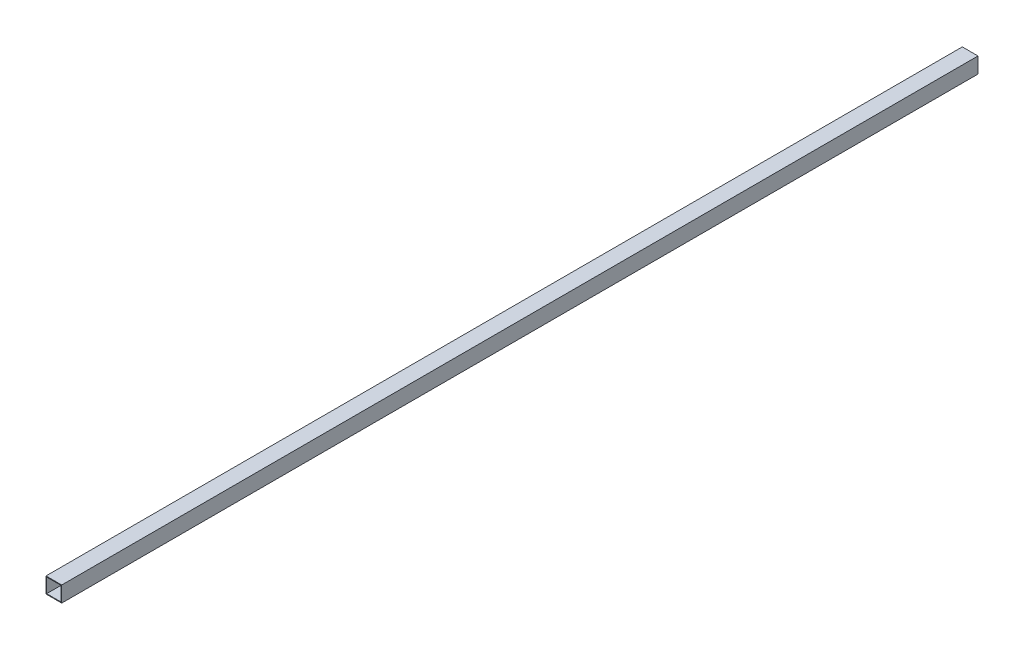
ISO-10303-21;
HEADER;
FILE_DESCRIPTION(('STEP AP214'),'2;1');
FILE_NAME('part.step','',(''),(''),'','','');
FILE_SCHEMA(('AUTOMOTIVE_DESIGN { 1 0 10303 214 1 1 1 1 }'));
ENDSEC;
DATA;
#1=APPLICATION_CONTEXT('core data for automotive mechanical design processes');
#2=APPLICATION_PROTOCOL_DEFINITION('international standard','automotive_design',2000,#1);
#3=PRODUCT_CONTEXT('',#1,'mechanical');
#4=PRODUCT('Part','Part','',(#3));
#5=PRODUCT_RELATED_PRODUCT_CATEGORY('part','',(#4));
#6=PRODUCT_DEFINITION_FORMATION('','',#4);
#7=PRODUCT_DEFINITION_CONTEXT('part definition',#1,'design');
#8=PRODUCT_DEFINITION('design','',#6,#7);
#9=PRODUCT_DEFINITION_SHAPE('','',#8);
#10=(LENGTH_UNIT() NAMED_UNIT(*) SI_UNIT(.MILLI.,.METRE.));
#11=(NAMED_UNIT(*) PLANE_ANGLE_UNIT() SI_UNIT($,.RADIAN.));
#12=(NAMED_UNIT(*) SI_UNIT($,.STERADIAN.) SOLID_ANGLE_UNIT());
#13=UNCERTAINTY_MEASURE_WITH_UNIT(LENGTH_MEASURE(1.E-05),#10,'distance_accuracy_value','');
#14=(GEOMETRIC_REPRESENTATION_CONTEXT(3) GLOBAL_UNCERTAINTY_ASSIGNED_CONTEXT((#13)) GLOBAL_UNIT_ASSIGNED_CONTEXT((#10,
#11,#12)) REPRESENTATION_CONTEXT('',''));
#15=CARTESIAN_POINT('',(0.,0.,0.));
#16=DIRECTION('',(0.,0.,1.));
#17=DIRECTION('',(1.,0.,0.));
#18=AXIS2_PLACEMENT_3D('',#15,#16,#17);
#19=CARTESIAN_POINT('',(0.,0.,2222.5));
#20=DIRECTION('',(0.,0.,-1.));
#21=DIRECTION('',(-1.,0.,0.));
#22=AXIS2_PLACEMENT_3D('',#19,#20,#21);
#23=PLANE('',#22);
#24=DIRECTION('',(0.,-1.,0.));
#25=VECTOR('',#24,1.);
#26=CARTESIAN_POINT('',(0.,0.,2222.5));
#27=LINE('',#26,#25);
#28=CARTESIAN_POINT('',(0.,38.1,2222.5));
#29=VERTEX_POINT('',#28);
#30=CARTESIAN_POINT('',(0.,0.,2222.5));
#31=VERTEX_POINT('',#30);
#32=EDGE_CURVE('E136',#29,#31,#27,.T.);
#33=ORIENTED_EDGE('',*,*,#32,.T.);
#34=DIRECTION('',(1.,0.,0.));
#35=VECTOR('',#34,1.);
#36=CARTESIAN_POINT('',(0.,0.,2222.5));
#37=LINE('',#36,#35);
#38=CARTESIAN_POINT('',(38.1,0.,2222.5));
#39=VERTEX_POINT('',#38);
#40=EDGE_CURVE('E139',#31,#39,#37,.T.);
#41=ORIENTED_EDGE('',*,*,#40,.T.);
#42=DIRECTION('',(0.,1.,0.));
#43=VECTOR('',#42,1.);
#44=CARTESIAN_POINT('',(38.1,0.,2222.5));
#45=LINE('',#44,#43);
#46=CARTESIAN_POINT('',(38.1,38.1,2222.5));
#47=VERTEX_POINT('',#46);
#48=EDGE_CURVE('E142',#39,#47,#45,.T.);
#49=ORIENTED_EDGE('',*,*,#48,.T.);
#50=DIRECTION('',(-1.,0.,0.));
#51=VECTOR('',#50,1.);
#52=CARTESIAN_POINT('',(0.,38.1,2222.5));
#53=LINE('',#52,#51);
#54=EDGE_CURVE('E144',#47,#29,#53,.T.);
#55=ORIENTED_EDGE('',*,*,#54,.T.);
#56=EDGE_LOOP('',(#33,#41,#49,#55));
#57=FACE_BOUND('',#56,.T.);
#58=DIRECTION('',(0.,-1.,0.));
#59=VECTOR('',#58,1.);
#60=CARTESIAN_POINT('',(1.5875,1.5875,2222.5));
#61=LINE('',#60,#59);
#62=CARTESIAN_POINT('',(1.5875,36.5125,2222.5));
#63=VERTEX_POINT('',#62);
#64=CARTESIAN_POINT('',(1.5875,1.5875,2222.5));
#65=VERTEX_POINT('',#64);
#66=EDGE_CURVE('E100',#63,#65,#61,.T.);
#67=ORIENTED_EDGE('',*,*,#66,.F.);
#68=DIRECTION('',(-1.,0.,0.));
#69=VECTOR('',#68,1.);
#70=CARTESIAN_POINT('',(1.5875,36.5125,2222.5));
#71=LINE('',#70,#69);
#72=CARTESIAN_POINT('',(36.5125,36.5125,2222.5));
#73=VERTEX_POINT('',#72);
#74=EDGE_CURVE('E122',#73,#63,#71,.T.);
#75=ORIENTED_EDGE('',*,*,#74,.F.);
#76=DIRECTION('',(0.,1.,0.));
#77=VECTOR('',#76,1.);
#78=CARTESIAN_POINT('',(36.5125,1.5875,2222.5));
#79=LINE('',#78,#77);
#80=CARTESIAN_POINT('',(36.5125,1.5875,2222.5));
#81=VERTEX_POINT('',#80);
#82=EDGE_CURVE('E120',#81,#73,#79,.T.);
#83=ORIENTED_EDGE('',*,*,#82,.F.);
#84=DIRECTION('',(1.,0.,0.));
#85=VECTOR('',#84,1.);
#86=CARTESIAN_POINT('',(1.5875,1.5875,2222.5));
#87=LINE('',#86,#85);
#88=EDGE_CURVE('E108',#65,#81,#87,.T.);
#89=ORIENTED_EDGE('',*,*,#88,.F.);
#90=EDGE_LOOP('',(#67,#75,#83,#89));
#91=FACE_BOUND('',#90,.T.);
#92=ADVANCED_FACE('F35',(#57,#91),#23,.F.);
#93=CARTESIAN_POINT('',(0.,0.,0.));
#94=DIRECTION('',(0.,0.,-1.));
#95=DIRECTION('',(-1.,0.,0.));
#96=AXIS2_PLACEMENT_3D('',#93,#94,#95);
#97=PLANE('',#96);
#98=DIRECTION('',(0.,-1.,0.));
#99=VECTOR('',#98,1.);
#100=CARTESIAN_POINT('',(0.,0.,0.));
#101=LINE('',#100,#99);
#102=CARTESIAN_POINT('',(0.,38.1,0.));
#103=VERTEX_POINT('',#102);
#104=CARTESIAN_POINT('',(0.,0.,0.));
#105=VERTEX_POINT('',#104);
#106=EDGE_CURVE('E116',#103,#105,#101,.T.);
#107=ORIENTED_EDGE('',*,*,#106,.F.);
#108=DIRECTION('',(-1.,0.,0.));
#109=VECTOR('',#108,1.);
#110=CARTESIAN_POINT('',(0.,38.1,0.));
#111=LINE('',#110,#109);
#112=CARTESIAN_POINT('',(38.1,38.1,0.));
#113=VERTEX_POINT('',#112);
#114=EDGE_CURVE('E140',#113,#103,#111,.T.);
#115=ORIENTED_EDGE('',*,*,#114,.F.);
#116=DIRECTION('',(0.,1.,0.));
#117=VECTOR('',#116,1.);
#118=CARTESIAN_POINT('',(38.1,0.,0.));
#119=LINE('',#118,#117);
#120=CARTESIAN_POINT('',(38.1,0.,0.));
#121=VERTEX_POINT('',#120);
#122=EDGE_CURVE('E151',#121,#113,#119,.T.);
#123=ORIENTED_EDGE('',*,*,#122,.F.);
#124=DIRECTION('',(1.,0.,0.));
#125=VECTOR('',#124,1.);
#126=CARTESIAN_POINT('',(0.,0.,0.));
#127=LINE('',#126,#125);
#128=EDGE_CURVE('E149',#105,#121,#127,.T.);
#129=ORIENTED_EDGE('',*,*,#128,.F.);
#130=EDGE_LOOP('',(#107,#115,#123,#129));
#131=FACE_BOUND('',#130,.T.);
#132=DIRECTION('',(-1.,0.,0.));
#133=VECTOR('',#132,1.);
#134=CARTESIAN_POINT('',(1.5875,36.5125,0.));
#135=LINE('',#134,#133);
#136=CARTESIAN_POINT('',(36.5125,36.5125,0.));
#137=VERTEX_POINT('',#136);
#138=CARTESIAN_POINT('',(1.5875,36.5125,0.));
#139=VERTEX_POINT('',#138);
#140=EDGE_CURVE('E109',#137,#139,#135,.T.);
#141=ORIENTED_EDGE('',*,*,#140,.T.);
#142=DIRECTION('',(0.,-1.,0.));
#143=VECTOR('',#142,1.);
#144=CARTESIAN_POINT('',(1.5875,1.5875,0.));
#145=LINE('',#144,#143);
#146=CARTESIAN_POINT('',(1.5875,1.5875,0.));
#147=VERTEX_POINT('',#146);
#148=EDGE_CURVE('E58',#139,#147,#145,.T.);
#149=ORIENTED_EDGE('',*,*,#148,.T.);
#150=DIRECTION('',(1.,0.,0.));
#151=VECTOR('',#150,1.);
#152=CARTESIAN_POINT('',(1.5875,1.5875,0.));
#153=LINE('',#152,#151);
#154=CARTESIAN_POINT('',(36.5125,1.5875,0.));
#155=VERTEX_POINT('',#154);
#156=EDGE_CURVE('E115',#147,#155,#153,.T.);
#157=ORIENTED_EDGE('',*,*,#156,.T.);
#158=DIRECTION('',(0.,1.,0.));
#159=VECTOR('',#158,1.);
#160=CARTESIAN_POINT('',(36.5125,1.5875,0.));
#161=LINE('',#160,#159);
#162=EDGE_CURVE('E128',#155,#137,#161,.T.);
#163=ORIENTED_EDGE('',*,*,#162,.T.);
#164=EDGE_LOOP('',(#141,#149,#157,#163));
#165=FACE_BOUND('',#164,.T.);
#166=ADVANCED_FACE('F169',(#131,#165),#97,.T.);
#167=CARTESIAN_POINT('',(0.,0.,2222.5));
#168=DIRECTION('',(1.,0.,0.));
#169=DIRECTION('',(0.,0.,-1.));
#170=AXIS2_PLACEMENT_3D('',#167,#168,#169);
#171=PLANE('',#170);
#172=ORIENTED_EDGE('',*,*,#106,.T.);
#173=DIRECTION('',(0.,0.,-1.));
#174=VECTOR('',#173,1.);
#175=CARTESIAN_POINT('',(0.,0.,2222.5));
#176=LINE('',#175,#174);
#177=EDGE_CURVE('E11',#31,#105,#176,.T.);
#178=ORIENTED_EDGE('',*,*,#177,.F.);
#179=ORIENTED_EDGE('',*,*,#32,.F.);
#180=DIRECTION('',(0.,0.,-1.));
#181=VECTOR('',#180,1.);
#182=CARTESIAN_POINT('',(0.,38.1,2222.5));
#183=LINE('',#182,#181);
#184=EDGE_CURVE('E146',#29,#103,#183,.T.);
#185=ORIENTED_EDGE('',*,*,#184,.T.);
#186=EDGE_LOOP('',(#172,#178,#179,#185));
#187=FACE_BOUND('',#186,.T.);
#188=ADVANCED_FACE('F37',(#187),#171,.F.);
#189=CARTESIAN_POINT('',(0.,0.,2222.5));
#190=DIRECTION('',(0.,1.,0.));
#191=DIRECTION('',(0.,0.,1.));
#192=AXIS2_PLACEMENT_3D('',#189,#190,#191);
#193=PLANE('',#192);
#194=ORIENTED_EDGE('',*,*,#128,.T.);
#195=DIRECTION('',(0.,0.,-1.));
#196=VECTOR('',#195,1.);
#197=CARTESIAN_POINT('',(38.1,0.,2222.5));
#198=LINE('',#197,#196);
#199=EDGE_CURVE('E43',#39,#121,#198,.T.);
#200=ORIENTED_EDGE('',*,*,#199,.F.);
#201=ORIENTED_EDGE('',*,*,#40,.F.);
#202=ORIENTED_EDGE('',*,*,#177,.T.);
#203=EDGE_LOOP('',(#194,#200,#201,#202));
#204=FACE_BOUND('',#203,.T.);
#205=ADVANCED_FACE('F179',(#204),#193,.F.);
#206=CARTESIAN_POINT('',(38.1,0.,2222.5));
#207=DIRECTION('',(-1.,0.,0.));
#208=DIRECTION('',(0.,0.,1.));
#209=AXIS2_PLACEMENT_3D('',#206,#207,#208);
#210=PLANE('',#209);
#211=ORIENTED_EDGE('',*,*,#122,.T.);
#212=DIRECTION('',(0.,0.,-1.));
#213=VECTOR('',#212,1.);
#214=CARTESIAN_POINT('',(38.1,38.1,2222.5));
#215=LINE('',#214,#213);
#216=EDGE_CURVE('E156',#47,#113,#215,.T.);
#217=ORIENTED_EDGE('',*,*,#216,.F.);
#218=ORIENTED_EDGE('',*,*,#48,.F.);
#219=ORIENTED_EDGE('',*,*,#199,.T.);
#220=EDGE_LOOP('',(#211,#217,#218,#219));
#221=FACE_BOUND('',#220,.T.);
#222=ADVANCED_FACE('F163',(#221),#210,.F.);
#223=CARTESIAN_POINT('',(0.,38.1,2222.5));
#224=DIRECTION('',(0.,-1.,0.));
#225=DIRECTION('',(0.,0.,-1.));
#226=AXIS2_PLACEMENT_3D('',#223,#224,#225);
#227=PLANE('',#226);
#228=ORIENTED_EDGE('',*,*,#114,.T.);
#229=ORIENTED_EDGE('',*,*,#184,.F.);
#230=ORIENTED_EDGE('',*,*,#54,.F.);
#231=ORIENTED_EDGE('',*,*,#216,.T.);
#232=EDGE_LOOP('',(#228,#229,#230,#231));
#233=FACE_BOUND('',#232,.T.);
#234=ADVANCED_FACE('F173',(#233),#227,.F.);
#235=CARTESIAN_POINT('',(1.5875,1.5875,2222.5));
#236=DIRECTION('',(1.,0.,0.));
#237=DIRECTION('',(0.,1.,0.));
#238=AXIS2_PLACEMENT_3D('',#235,#236,#237);
#239=PLANE('',#238);
#240=ORIENTED_EDGE('',*,*,#148,.F.);
#241=DIRECTION('',(0.,0.,-1.));
#242=VECTOR('',#241,1.);
#243=CARTESIAN_POINT('',(1.5875,36.5125,2222.5));
#244=LINE('',#243,#242);
#245=EDGE_CURVE('E104',#63,#139,#244,.T.);
#246=ORIENTED_EDGE('',*,*,#245,.F.);
#247=ORIENTED_EDGE('',*,*,#66,.T.);
#248=DIRECTION('',(0.,0.,-1.));
#249=VECTOR('',#248,1.);
#250=CARTESIAN_POINT('',(1.5875,1.5875,2222.5));
#251=LINE('',#250,#249);
#252=EDGE_CURVE('E103',#65,#147,#251,.T.);
#253=ORIENTED_EDGE('',*,*,#252,.T.);
#254=EDGE_LOOP('',(#240,#246,#247,#253));
#255=FACE_BOUND('',#254,.T.);
#256=ADVANCED_FACE('F102',(#255),#239,.T.);
#257=CARTESIAN_POINT('',(1.5875,1.5875,2222.5));
#258=DIRECTION('',(0.,1.,0.));
#259=DIRECTION('',(0.,0.,1.));
#260=AXIS2_PLACEMENT_3D('',#257,#258,#259);
#261=PLANE('',#260);
#262=ORIENTED_EDGE('',*,*,#156,.F.);
#263=ORIENTED_EDGE('',*,*,#252,.F.);
#264=ORIENTED_EDGE('',*,*,#88,.T.);
#265=DIRECTION('',(0.,0.,-1.));
#266=VECTOR('',#265,1.);
#267=CARTESIAN_POINT('',(36.5125,1.5875,2222.5));
#268=LINE('',#267,#266);
#269=EDGE_CURVE('E117',#81,#155,#268,.T.);
#270=ORIENTED_EDGE('',*,*,#269,.T.);
#271=EDGE_LOOP('',(#262,#263,#264,#270));
#272=FACE_BOUND('',#271,.T.);
#273=ADVANCED_FACE('F112',(#272),#261,.T.);
#274=CARTESIAN_POINT('',(36.5125,1.5875,2222.5));
#275=DIRECTION('',(-1.,0.,0.));
#276=DIRECTION('',(0.,0.,1.));
#277=AXIS2_PLACEMENT_3D('',#274,#275,#276);
#278=PLANE('',#277);
#279=ORIENTED_EDGE('',*,*,#162,.F.);
#280=ORIENTED_EDGE('',*,*,#269,.F.);
#281=ORIENTED_EDGE('',*,*,#82,.T.);
#282=DIRECTION('',(0.,0.,-1.));
#283=VECTOR('',#282,1.);
#284=CARTESIAN_POINT('',(36.5125,36.5125,2222.5));
#285=LINE('',#284,#283);
#286=EDGE_CURVE('E50',#73,#137,#285,.T.);
#287=ORIENTED_EDGE('',*,*,#286,.T.);
#288=EDGE_LOOP('',(#279,#280,#281,#287));
#289=FACE_BOUND('',#288,.T.);
#290=ADVANCED_FACE('F202',(#289),#278,.T.);
#291=CARTESIAN_POINT('',(1.5875,36.5125,2222.5));
#292=DIRECTION('',(0.,-1.,0.));
#293=DIRECTION('',(0.,0.,-1.));
#294=AXIS2_PLACEMENT_3D('',#291,#292,#293);
#295=PLANE('',#294);
#296=ORIENTED_EDGE('',*,*,#140,.F.);
#297=ORIENTED_EDGE('',*,*,#286,.F.);
#298=ORIENTED_EDGE('',*,*,#74,.T.);
#299=ORIENTED_EDGE('',*,*,#245,.T.);
#300=EDGE_LOOP('',(#296,#297,#298,#299));
#301=FACE_BOUND('',#300,.T.);
#302=ADVANCED_FACE('F206',(#301),#295,.T.);
#303=CLOSED_SHELL('',(#92,#166,#188,#205,#222,#234,#256,#273,#290,#302));
#304=MANIFOLD_SOLID_BREP('B2',#303);
#305=ADVANCED_BREP_SHAPE_REPRESENTATION('',(#18,#304),#14);
#306=SHAPE_DEFINITION_REPRESENTATION(#9,#305);
ENDSEC;
END-ISO-10303-21;
